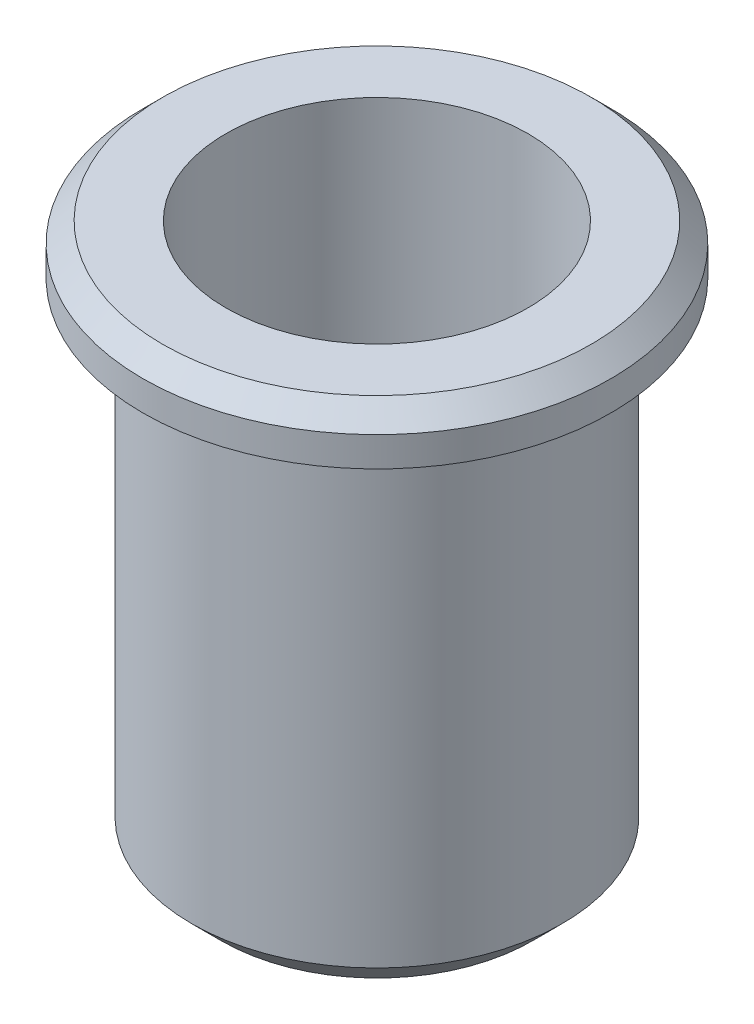
ISO-10303-21;
HEADER;
FILE_DESCRIPTION(('STEP AP214'),'2;1');
FILE_NAME('part.step','',(''),(''),'','','');
FILE_SCHEMA(('AUTOMOTIVE_DESIGN { 1 0 10303 214 1 1 1 1 }'));
ENDSEC;
DATA;
#1=APPLICATION_CONTEXT('core data for automotive mechanical design processes');
#2=APPLICATION_PROTOCOL_DEFINITION('international standard','automotive_design',2000,#1);
#3=PRODUCT_CONTEXT('',#1,'mechanical');
#4=PRODUCT('Part','Part','',(#3));
#5=PRODUCT_RELATED_PRODUCT_CATEGORY('part','',(#4));
#6=PRODUCT_DEFINITION_FORMATION('','',#4);
#7=PRODUCT_DEFINITION_CONTEXT('part definition',#1,'design');
#8=PRODUCT_DEFINITION('design','',#6,#7);
#9=PRODUCT_DEFINITION_SHAPE('','',#8);
#10=(LENGTH_UNIT() NAMED_UNIT(*) SI_UNIT(.MILLI.,.METRE.));
#11=(NAMED_UNIT(*) PLANE_ANGLE_UNIT() SI_UNIT($,.RADIAN.));
#12=(NAMED_UNIT(*) SI_UNIT($,.STERADIAN.) SOLID_ANGLE_UNIT());
#13=UNCERTAINTY_MEASURE_WITH_UNIT(LENGTH_MEASURE(1.E-05),#10,'distance_accuracy_value','');
#14=(GEOMETRIC_REPRESENTATION_CONTEXT(3) GLOBAL_UNCERTAINTY_ASSIGNED_CONTEXT((#13)) GLOBAL_UNIT_ASSIGNED_CONTEXT((#10,
#11,#12)) REPRESENTATION_CONTEXT('',''));
#15=CARTESIAN_POINT('',(0.,0.,0.));
#16=DIRECTION('',(0.,0.,1.));
#17=DIRECTION('',(1.,0.,0.));
#18=AXIS2_PLACEMENT_3D('',#15,#16,#17);
#19=CARTESIAN_POINT('',(0.,25.1479120878423,0.));
#20=DIRECTION('',(0.,1.,0.));
#21=DIRECTION('',(0.,0.,1.));
#22=AXIS2_PLACEMENT_3D('',#19,#20,#21);
#23=CYLINDRICAL_SURFACE('',#22,1.9939);
#24=CARTESIAN_POINT('',(0.,0.,0.));
#25=DIRECTION('',(0.,1.,0.));
#26=DIRECTION('',(0.,0.,1.));
#27=AXIS2_PLACEMENT_3D('',#24,#25,#26);
#28=CIRCLE('',#27,1.9939);
#29=CARTESIAN_POINT('',(0.,0.,1.9939));
#30=VERTEX_POINT('',#29);
#31=EDGE_CURVE('E10',#30,#30,#28,.T.);
#32=ORIENTED_EDGE('',*,*,#31,.F.);
#33=EDGE_LOOP('',(#32));
#34=FACE_BOUND('',#33,.T.);
#35=CARTESIAN_POINT('',(0.,2.36523438534684,0.));
#36=DIRECTION('',(0.,1.,0.));
#37=DIRECTION('',(0.,0.,1.));
#38=AXIS2_PLACEMENT_3D('',#35,#36,#37);
#39=CIRCLE('',#38,1.9939);
#40=CARTESIAN_POINT('',(0.,2.36523438534684,1.9939));
#41=VERTEX_POINT('',#40);
#42=EDGE_CURVE('E72',#41,#41,#39,.T.);
#43=ORIENTED_EDGE('',*,*,#42,.T.);
#44=EDGE_LOOP('',(#43));
#45=FACE_BOUND('',#44,.T.);
#46=ADVANCED_FACE('F40',(#34,#45),#23,.F.);
#47=CARTESIAN_POINT('',(1.9939,0.,0.));
#48=DIRECTION('',(0.,1.,0.));
#49=DIRECTION('',(0.,0.,1.));
#50=AXIS2_PLACEMENT_3D('',#47,#48,#49);
#51=PLANE('',#50);
#52=CARTESIAN_POINT('',(0.,0.,0.));
#53=DIRECTION('',(0.,1.,0.));
#54=DIRECTION('',(0.,0.,1.));
#55=AXIS2_PLACEMENT_3D('',#52,#53,#54);
#56=CIRCLE('',#55,3.98800000000001);
#57=CARTESIAN_POINT('',(0.,0.,3.98800000000001));
#58=VERTEX_POINT('',#57);
#59=EDGE_CURVE('E43',#58,#58,#56,.T.);
#60=ORIENTED_EDGE('',*,*,#59,.F.);
#61=EDGE_LOOP('',(#60));
#62=FACE_BOUND('',#61,.T.);
#63=ORIENTED_EDGE('',*,*,#31,.T.);
#64=EDGE_LOOP('',(#63));
#65=FACE_BOUND('',#64,.T.);
#66=ADVANCED_FACE('F116',(#62,#65),#51,.F.);
#67=CARTESIAN_POINT('',(0.,0.,0.));
#68=DIRECTION('',(0.,1.,0.));
#69=DIRECTION('',(0.,0.,1.));
#70=AXIS2_PLACEMENT_3D('',#67,#68,#69);
#71=CONICAL_SURFACE('',#70,3.98800000000001,0.785398163397447);
#72=CARTESIAN_POINT('',(0.,0.761999999999999,0.));
#73=DIRECTION('',(0.,1.,0.));
#74=DIRECTION('',(0.,0.,1.));
#75=AXIS2_PLACEMENT_3D('',#72,#73,#74);
#76=CIRCLE('',#75,4.75);
#77=CARTESIAN_POINT('',(0.,0.761999999999999,4.75));
#78=VERTEX_POINT('',#77);
#79=EDGE_CURVE('E50',#78,#78,#76,.T.);
#80=ORIENTED_EDGE('',*,*,#79,.F.);
#81=EDGE_LOOP('',(#80));
#82=FACE_BOUND('',#81,.T.);
#83=ORIENTED_EDGE('',*,*,#59,.T.);
#84=EDGE_LOOP('',(#83));
#85=FACE_BOUND('',#84,.T.);
#86=ADVANCED_FACE('F113',(#82,#85),#71,.T.);
#87=CARTESIAN_POINT('',(0.,25.1479120878423,0.));
#88=DIRECTION('',(0.,1.,0.));
#89=DIRECTION('',(0.,0.,1.));
#90=AXIS2_PLACEMENT_3D('',#87,#88,#89);
#91=CYLINDRICAL_SURFACE('',#90,4.75);
#92=CARTESIAN_POINT('',(0.,12.73,0.));
#93=DIRECTION('',(0.,1.,0.));
#94=DIRECTION('',(0.,0.,1.));
#95=AXIS2_PLACEMENT_3D('',#92,#93,#94);
#96=CIRCLE('',#95,4.75);
#97=CARTESIAN_POINT('',(0.,12.73,4.75));
#98=VERTEX_POINT('',#97);
#99=EDGE_CURVE('E51',#98,#98,#96,.T.);
#100=ORIENTED_EDGE('',*,*,#99,.F.);
#101=EDGE_LOOP('',(#100));
#102=FACE_BOUND('',#101,.T.);
#103=ORIENTED_EDGE('',*,*,#79,.T.);
#104=EDGE_LOOP('',(#103));
#105=FACE_BOUND('',#104,.T.);
#106=ADVANCED_FACE('F109',(#102,#105),#91,.T.);
#107=CARTESIAN_POINT('',(4.75,12.73,0.));
#108=DIRECTION('',(0.,1.,0.));
#109=DIRECTION('',(0.,0.,1.));
#110=AXIS2_PLACEMENT_3D('',#107,#108,#109);
#111=PLANE('',#110);
#112=CARTESIAN_POINT('',(0.,12.73,0.));
#113=DIRECTION('',(0.,1.,0.));
#114=DIRECTION('',(0.,0.,1.));
#115=AXIS2_PLACEMENT_3D('',#112,#113,#114);
#116=CIRCLE('',#115,6.);
#117=CARTESIAN_POINT('',(0.,12.73,6.));
#118=VERTEX_POINT('',#117);
#119=EDGE_CURVE('E57',#118,#118,#116,.T.);
#120=ORIENTED_EDGE('',*,*,#119,.F.);
#121=EDGE_LOOP('',(#120));
#122=FACE_BOUND('',#121,.T.);
#123=ORIENTED_EDGE('',*,*,#99,.T.);
#124=EDGE_LOOP('',(#123));
#125=FACE_BOUND('',#124,.T.);
#126=ADVANCED_FACE('F104',(#122,#125),#111,.F.);
#127=CARTESIAN_POINT('',(0.,25.1479120878423,0.));
#128=DIRECTION('',(0.,1.,0.));
#129=DIRECTION('',(0.,0.,1.));
#130=AXIS2_PLACEMENT_3D('',#127,#128,#129);
#131=CYLINDRICAL_SURFACE('',#130,6.);
#132=CARTESIAN_POINT('',(0.,13.492,0.));
#133=DIRECTION('',(0.,1.,0.));
#134=DIRECTION('',(0.,0.,1.));
#135=AXIS2_PLACEMENT_3D('',#132,#133,#134);
#136=CIRCLE('',#135,6.);
#137=CARTESIAN_POINT('',(0.,13.492,6.));
#138=VERTEX_POINT('',#137);
#139=EDGE_CURVE('E56',#138,#138,#136,.T.);
#140=ORIENTED_EDGE('',*,*,#139,.F.);
#141=EDGE_LOOP('',(#140));
#142=FACE_BOUND('',#141,.T.);
#143=ORIENTED_EDGE('',*,*,#119,.T.);
#144=EDGE_LOOP('',(#143));
#145=FACE_BOUND('',#144,.T.);
#146=ADVANCED_FACE('F100',(#142,#145),#131,.T.);
#147=CARTESIAN_POINT('',(0.,13.492,0.));
#148=DIRECTION('',(0.,-1.,0.));
#149=DIRECTION('',(0.,0.,-1.));
#150=AXIS2_PLACEMENT_3D('',#147,#148,#149);
#151=CONICAL_SURFACE('',#150,6.,0.785398163397451);
#152=CARTESIAN_POINT('',(0.,14.,0.));
#153=DIRECTION('',(0.,1.,0.));
#154=DIRECTION('',(0.,0.,1.));
#155=AXIS2_PLACEMENT_3D('',#152,#153,#154);
#156=CIRCLE('',#155,5.492);
#157=CARTESIAN_POINT('',(0.,14.,5.492));
#158=VERTEX_POINT('',#157);
#159=EDGE_CURVE('E65',#158,#158,#156,.T.);
#160=ORIENTED_EDGE('',*,*,#159,.F.);
#161=EDGE_LOOP('',(#160));
#162=FACE_BOUND('',#161,.T.);
#163=ORIENTED_EDGE('',*,*,#139,.T.);
#164=EDGE_LOOP('',(#163));
#165=FACE_BOUND('',#164,.T.);
#166=ADVANCED_FACE('F91',(#162,#165),#151,.T.);
#167=CARTESIAN_POINT('',(5.492,14.,0.));
#168=DIRECTION('',(0.,-1.,0.));
#169=DIRECTION('',(0.,0.,-1.));
#170=AXIS2_PLACEMENT_3D('',#167,#168,#169);
#171=PLANE('',#170);
#172=CARTESIAN_POINT('',(0.,14.,0.));
#173=DIRECTION('',(0.,1.,0.));
#174=DIRECTION('',(0.,0.,1.));
#175=AXIS2_PLACEMENT_3D('',#172,#173,#174);
#176=CIRCLE('',#175,3.8735);
#177=CARTESIAN_POINT('',(0.,14.,3.8735));
#178=VERTEX_POINT('',#177);
#179=EDGE_CURVE('E61',#178,#178,#176,.T.);
#180=ORIENTED_EDGE('',*,*,#179,.F.);
#181=EDGE_LOOP('',(#180));
#182=FACE_BOUND('',#181,.T.);
#183=ORIENTED_EDGE('',*,*,#159,.T.);
#184=EDGE_LOOP('',(#183));
#185=FACE_BOUND('',#184,.T.);
#186=ADVANCED_FACE('F82',(#182,#185),#171,.F.);
#187=CARTESIAN_POINT('',(0.,25.1479120878423,0.));
#188=DIRECTION('',(0.,1.,0.));
#189=DIRECTION('',(0.,0.,1.));
#190=AXIS2_PLACEMENT_3D('',#187,#188,#189);
#191=CYLINDRICAL_SURFACE('',#190,3.8735);
#192=CARTESIAN_POINT('',(0.,2.36523438534684,0.));
#193=DIRECTION('',(0.,1.,0.));
#194=DIRECTION('',(0.,0.,1.));
#195=AXIS2_PLACEMENT_3D('',#192,#193,#194);
#196=CIRCLE('',#195,3.8735);
#197=CARTESIAN_POINT('',(0.,2.36523438534684,3.8735));
#198=VERTEX_POINT('',#197);
#199=EDGE_CURVE('E66',#198,#198,#196,.T.);
#200=ORIENTED_EDGE('',*,*,#199,.F.);
#201=EDGE_LOOP('',(#200));
#202=FACE_BOUND('',#201,.T.);
#203=ORIENTED_EDGE('',*,*,#179,.T.);
#204=EDGE_LOOP('',(#203));
#205=FACE_BOUND('',#204,.T.);
#206=ADVANCED_FACE('F80',(#202,#205),#191,.F.);
#207=CARTESIAN_POINT('',(3.8735,2.36523438534684,0.));
#208=DIRECTION('',(0.,-1.,0.));
#209=DIRECTION('',(0.,0.,-1.));
#210=AXIS2_PLACEMENT_3D('',#207,#208,#209);
#211=PLANE('',#210);
#212=ORIENTED_EDGE('',*,*,#42,.F.);
#213=EDGE_LOOP('',(#212));
#214=FACE_BOUND('',#213,.T.);
#215=ORIENTED_EDGE('',*,*,#199,.T.);
#216=EDGE_LOOP('',(#215));
#217=FACE_BOUND('',#216,.T.);
#218=ADVANCED_FACE('F78',(#214,#217),#211,.F.);
#219=CLOSED_SHELL('',(#46,#66,#86,#106,#126,#146,#166,#186,#206,#218));
#220=MANIFOLD_SOLID_BREP('B2',#219);
#221=ADVANCED_BREP_SHAPE_REPRESENTATION('',(#18,#220),#14);
#222=SHAPE_DEFINITION_REPRESENTATION(#9,#221);
ENDSEC;
END-ISO-10303-21;
